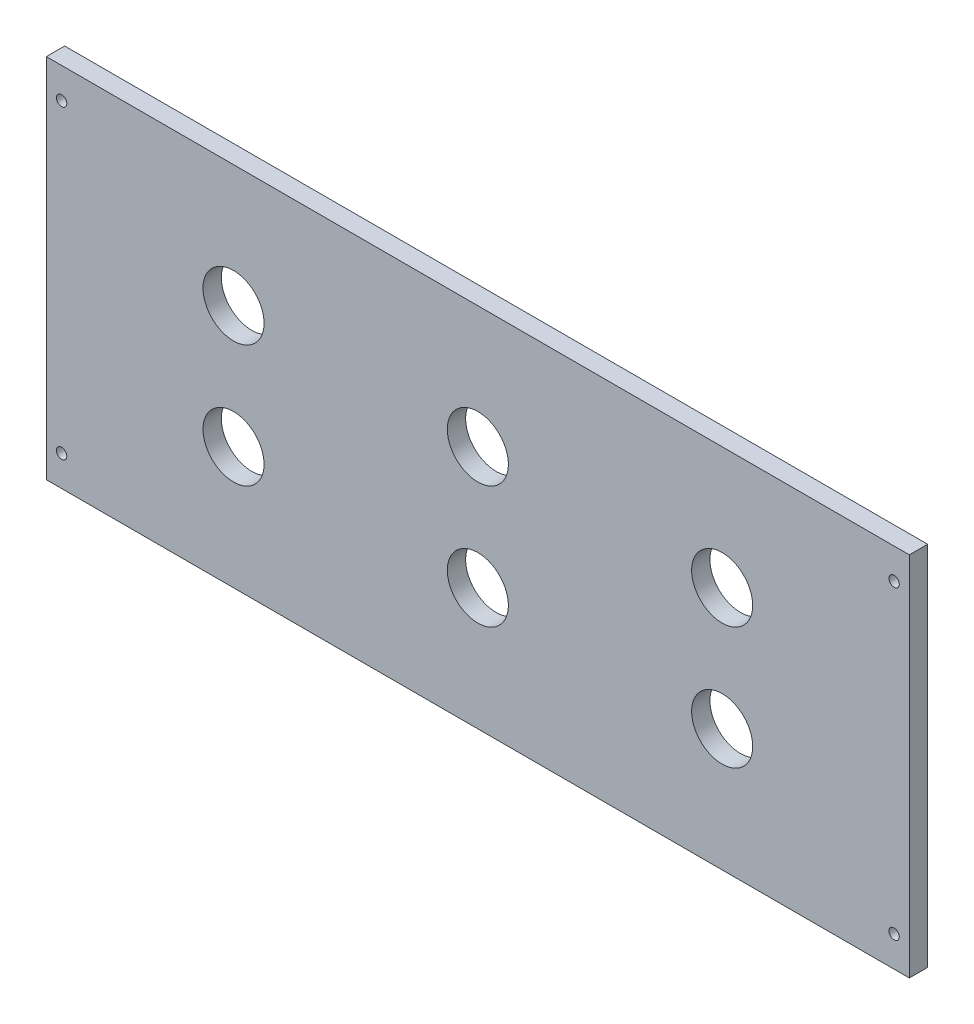
ISO-10303-21;
HEADER;
FILE_DESCRIPTION(('STEP AP214'),'2;1');
FILE_NAME('part.step','',(''),(''),'','','');
FILE_SCHEMA(('AUTOMOTIVE_DESIGN { 1 0 10303 214 1 1 1 1 }'));
ENDSEC;
DATA;
#1=APPLICATION_CONTEXT('core data for automotive mechanical design processes');
#2=APPLICATION_PROTOCOL_DEFINITION('international standard','automotive_design',2000,#1);
#3=PRODUCT_CONTEXT('',#1,'mechanical');
#4=PRODUCT('Part','Part','',(#3));
#5=PRODUCT_RELATED_PRODUCT_CATEGORY('part','',(#4));
#6=PRODUCT_DEFINITION_FORMATION('','',#4);
#7=PRODUCT_DEFINITION_CONTEXT('part definition',#1,'design');
#8=PRODUCT_DEFINITION('design','',#6,#7);
#9=PRODUCT_DEFINITION_SHAPE('','',#8);
#10=(LENGTH_UNIT() NAMED_UNIT(*) SI_UNIT(.MILLI.,.METRE.));
#11=(NAMED_UNIT(*) PLANE_ANGLE_UNIT() SI_UNIT($,.RADIAN.));
#12=(NAMED_UNIT(*) SI_UNIT($,.STERADIAN.) SOLID_ANGLE_UNIT());
#13=UNCERTAINTY_MEASURE_WITH_UNIT(LENGTH_MEASURE(1.E-05),#10,'distance_accuracy_value','');
#14=(GEOMETRIC_REPRESENTATION_CONTEXT(3) GLOBAL_UNCERTAINTY_ASSIGNED_CONTEXT((#13)) GLOBAL_UNIT_ASSIGNED_CONTEXT((#10,
#11,#12)) REPRESENTATION_CONTEXT('',''));
#15=CARTESIAN_POINT('',(0.,0.,0.));
#16=DIRECTION('',(0.,0.,1.));
#17=DIRECTION('',(1.,0.,0.));
#18=AXIS2_PLACEMENT_3D('',#15,#16,#17);
#19=CARTESIAN_POINT('',(0.,0.,3.));
#20=DIRECTION('',(0.,0.,-1.));
#21=DIRECTION('',(-1.,0.,0.));
#22=AXIS2_PLACEMENT_3D('',#19,#20,#21);
#23=PLANE('',#22);
#24=DIRECTION('',(0.,1.,0.));
#25=VECTOR('',#24,1.);
#26=CARTESIAN_POINT('',(70.65,-30.,3.));
#27=LINE('',#26,#25);
#28=CARTESIAN_POINT('',(70.65,-30.,3.));
#29=VERTEX_POINT('',#28);
#30=CARTESIAN_POINT('',(70.65,30.,3.));
#31=VERTEX_POINT('',#30);
#32=EDGE_CURVE('E92',#29,#31,#27,.T.);
#33=ORIENTED_EDGE('',*,*,#32,.T.);
#34=DIRECTION('',(-1.,0.,0.));
#35=VECTOR('',#34,1.);
#36=CARTESIAN_POINT('',(-70.65,30.,3.));
#37=LINE('',#36,#35);
#38=CARTESIAN_POINT('',(-70.65,30.,3.));
#39=VERTEX_POINT('',#38);
#40=EDGE_CURVE('E87',#31,#39,#37,.T.);
#41=ORIENTED_EDGE('',*,*,#40,.T.);
#42=DIRECTION('',(0.,-1.,0.));
#43=VECTOR('',#42,1.);
#44=CARTESIAN_POINT('',(-70.65,-30.,3.));
#45=LINE('',#44,#43);
#46=CARTESIAN_POINT('',(-70.65,-30.,3.));
#47=VERTEX_POINT('',#46);
#48=EDGE_CURVE('E90',#39,#47,#45,.T.);
#49=ORIENTED_EDGE('',*,*,#48,.T.);
#50=DIRECTION('',(1.,0.,0.));
#51=VECTOR('',#50,1.);
#52=CARTESIAN_POINT('',(-70.65,-30.,3.));
#53=LINE('',#52,#51);
#54=EDGE_CURVE('E57',#47,#29,#53,.T.);
#55=ORIENTED_EDGE('',*,*,#54,.T.);
#56=EDGE_LOOP('',(#33,#41,#49,#55));
#57=FACE_BOUND('',#56,.T.);
#58=CARTESIAN_POINT('',(-68.15,25.,3.));
#59=DIRECTION('',(0.,0.,1.));
#60=DIRECTION('',(1.,0.,0.));
#61=AXIS2_PLACEMENT_3D('',#58,#59,#60);
#62=CIRCLE('',#61,0.850000000000006);
#63=CARTESIAN_POINT('',(-67.3,25.,3.));
#64=VERTEX_POINT('',#63);
#65=EDGE_CURVE('E112',#64,#64,#62,.T.);
#66=ORIENTED_EDGE('',*,*,#65,.F.);
#67=EDGE_LOOP('',(#66));
#68=FACE_BOUND('',#67,.T.);
#69=CARTESIAN_POINT('',(-68.15,-25.,3.));
#70=DIRECTION('',(0.,0.,1.));
#71=DIRECTION('',(-1.,0.,0.));
#72=AXIS2_PLACEMENT_3D('',#69,#70,#71);
#73=CIRCLE('',#72,0.850000000000006);
#74=CARTESIAN_POINT('',(-69.,-25.,3.));
#75=VERTEX_POINT('',#74);
#76=EDGE_CURVE('E134',#75,#75,#73,.T.);
#77=ORIENTED_EDGE('',*,*,#76,.F.);
#78=EDGE_LOOP('',(#77));
#79=FACE_BOUND('',#78,.T.);
#80=CARTESIAN_POINT('',(68.15,-25.,3.));
#81=DIRECTION('',(0.,0.,1.));
#82=DIRECTION('',(1.,0.,0.));
#83=AXIS2_PLACEMENT_3D('',#80,#81,#82);
#84=CIRCLE('',#83,0.850000000000006);
#85=CARTESIAN_POINT('',(69.,-25.,3.));
#86=VERTEX_POINT('',#85);
#87=EDGE_CURVE('E142',#86,#86,#84,.T.);
#88=ORIENTED_EDGE('',*,*,#87,.F.);
#89=EDGE_LOOP('',(#88));
#90=FACE_BOUND('',#89,.T.);
#91=CARTESIAN_POINT('',(68.15,25.,3.));
#92=DIRECTION('',(0.,0.,1.));
#93=DIRECTION('',(-1.,0.,0.));
#94=AXIS2_PLACEMENT_3D('',#91,#92,#93);
#95=CIRCLE('',#94,0.850000000000006);
#96=CARTESIAN_POINT('',(67.3,25.,3.));
#97=VERTEX_POINT('',#96);
#98=EDGE_CURVE('E150',#97,#97,#95,.T.);
#99=ORIENTED_EDGE('',*,*,#98,.F.);
#100=EDGE_LOOP('',(#99));
#101=FACE_BOUND('',#100,.T.);
#102=CARTESIAN_POINT('',(0.,-10.,3.));
#103=DIRECTION('',(0.,0.,1.));
#104=DIRECTION('',(1.,0.,0.));
#105=AXIS2_PLACEMENT_3D('',#102,#103,#104);
#106=CIRCLE('',#105,5.);
#107=CARTESIAN_POINT('',(5.00000000000001,-10.,3.));
#108=VERTEX_POINT('',#107);
#109=EDGE_CURVE('E158',#108,#108,#106,.T.);
#110=ORIENTED_EDGE('',*,*,#109,.F.);
#111=EDGE_LOOP('',(#110));
#112=FACE_BOUND('',#111,.T.);
#113=CARTESIAN_POINT('',(-40.,-10.,3.));
#114=DIRECTION('',(0.,0.,1.));
#115=DIRECTION('',(1.,0.,0.));
#116=AXIS2_PLACEMENT_3D('',#113,#114,#115);
#117=CIRCLE('',#116,5.);
#118=CARTESIAN_POINT('',(-35.,-10.,3.));
#119=VERTEX_POINT('',#118);
#120=EDGE_CURVE('E166',#119,#119,#117,.T.);
#121=ORIENTED_EDGE('',*,*,#120,.F.);
#122=EDGE_LOOP('',(#121));
#123=FACE_BOUND('',#122,.T.);
#124=CARTESIAN_POINT('',(40.,-9.99999999999997,3.));
#125=DIRECTION('',(0.,0.,1.));
#126=DIRECTION('',(-1.,0.,0.));
#127=AXIS2_PLACEMENT_3D('',#124,#125,#126);
#128=CIRCLE('',#127,5.);
#129=CARTESIAN_POINT('',(35.,-9.99999999999997,3.));
#130=VERTEX_POINT('',#129);
#131=EDGE_CURVE('E174',#130,#130,#128,.T.);
#132=ORIENTED_EDGE('',*,*,#131,.F.);
#133=EDGE_LOOP('',(#132));
#134=FACE_BOUND('',#133,.T.);
#135=CARTESIAN_POINT('',(40.,9.99999999999996,3.));
#136=DIRECTION('',(0.,0.,1.));
#137=DIRECTION('',(1.,0.,0.));
#138=AXIS2_PLACEMENT_3D('',#135,#136,#137);
#139=CIRCLE('',#138,5.);
#140=CARTESIAN_POINT('',(45.,9.99999999999996,3.));
#141=VERTEX_POINT('',#140);
#142=EDGE_CURVE('E182',#141,#141,#139,.T.);
#143=ORIENTED_EDGE('',*,*,#142,.F.);
#144=EDGE_LOOP('',(#143));
#145=FACE_BOUND('',#144,.T.);
#146=CARTESIAN_POINT('',(0.,9.99999999999998,3.));
#147=DIRECTION('',(0.,0.,1.));
#148=DIRECTION('',(-1.,0.,0.));
#149=AXIS2_PLACEMENT_3D('',#146,#147,#148);
#150=CIRCLE('',#149,5.);
#151=CARTESIAN_POINT('',(-5.,9.99999999999998,3.));
#152=VERTEX_POINT('',#151);
#153=EDGE_CURVE('E190',#152,#152,#150,.T.);
#154=ORIENTED_EDGE('',*,*,#153,.F.);
#155=EDGE_LOOP('',(#154));
#156=FACE_BOUND('',#155,.T.);
#157=CARTESIAN_POINT('',(-40.,9.99999999999998,3.));
#158=DIRECTION('',(0.,0.,1.));
#159=DIRECTION('',(-1.,0.,0.));
#160=AXIS2_PLACEMENT_3D('',#157,#158,#159);
#161=CIRCLE('',#160,5.);
#162=CARTESIAN_POINT('',(-45.,9.99999999999998,3.));
#163=VERTEX_POINT('',#162);
#164=EDGE_CURVE('E198',#163,#163,#161,.T.);
#165=ORIENTED_EDGE('',*,*,#164,.F.);
#166=EDGE_LOOP('',(#165));
#167=FACE_BOUND('',#166,.T.);
#168=ADVANCED_FACE('F39',(#57,#68,#79,#90,#101,#112,#123,#134,#145,#156,#167),#23,.F.);
#169=CARTESIAN_POINT('',(0.,0.,0.));
#170=DIRECTION('',(0.,0.,-1.));
#171=DIRECTION('',(-1.,0.,0.));
#172=AXIS2_PLACEMENT_3D('',#169,#170,#171);
#173=PLANE('',#172);
#174=CARTESIAN_POINT('',(0.,9.99999999999998,0.));
#175=DIRECTION('',(0.,0.,1.));
#176=DIRECTION('',(-1.,0.,0.));
#177=AXIS2_PLACEMENT_3D('',#174,#175,#176);
#178=CIRCLE('',#177,5.);
#179=CARTESIAN_POINT('',(-5.,9.99999999999998,0.));
#180=VERTEX_POINT('',#179);
#181=EDGE_CURVE('E194',#180,#180,#178,.T.);
#182=ORIENTED_EDGE('',*,*,#181,.T.);
#183=EDGE_LOOP('',(#182));
#184=FACE_BOUND('',#183,.T.);
#185=CARTESIAN_POINT('',(40.,-9.99999999999997,0.));
#186=DIRECTION('',(0.,0.,1.));
#187=DIRECTION('',(-1.,0.,0.));
#188=AXIS2_PLACEMENT_3D('',#185,#186,#187);
#189=CIRCLE('',#188,5.);
#190=CARTESIAN_POINT('',(35.,-9.99999999999997,0.));
#191=VERTEX_POINT('',#190);
#192=EDGE_CURVE('E178',#191,#191,#189,.T.);
#193=ORIENTED_EDGE('',*,*,#192,.T.);
#194=EDGE_LOOP('',(#193));
#195=FACE_BOUND('',#194,.T.);
#196=CARTESIAN_POINT('',(0.,-10.,0.));
#197=DIRECTION('',(0.,0.,1.));
#198=DIRECTION('',(1.,0.,0.));
#199=AXIS2_PLACEMENT_3D('',#196,#197,#198);
#200=CIRCLE('',#199,5.);
#201=CARTESIAN_POINT('',(5.00000000000001,-10.,0.));
#202=VERTEX_POINT('',#201);
#203=EDGE_CURVE('E162',#202,#202,#200,.T.);
#204=ORIENTED_EDGE('',*,*,#203,.T.);
#205=EDGE_LOOP('',(#204));
#206=FACE_BOUND('',#205,.T.);
#207=CARTESIAN_POINT('',(68.15,-25.,0.));
#208=DIRECTION('',(0.,0.,1.));
#209=DIRECTION('',(1.,0.,0.));
#210=AXIS2_PLACEMENT_3D('',#207,#208,#209);
#211=CIRCLE('',#210,0.850000000000006);
#212=CARTESIAN_POINT('',(69.,-25.,0.));
#213=VERTEX_POINT('',#212);
#214=EDGE_CURVE('E146',#213,#213,#211,.T.);
#215=ORIENTED_EDGE('',*,*,#214,.T.);
#216=EDGE_LOOP('',(#215));
#217=FACE_BOUND('',#216,.T.);
#218=CARTESIAN_POINT('',(-68.15,25.,0.));
#219=DIRECTION('',(0.,0.,1.));
#220=DIRECTION('',(1.,0.,0.));
#221=AXIS2_PLACEMENT_3D('',#218,#219,#220);
#222=CIRCLE('',#221,0.850000000000006);
#223=CARTESIAN_POINT('',(-67.3,25.,0.));
#224=VERTEX_POINT('',#223);
#225=EDGE_CURVE('E130',#224,#224,#222,.T.);
#226=ORIENTED_EDGE('',*,*,#225,.T.);
#227=EDGE_LOOP('',(#226));
#228=FACE_BOUND('',#227,.T.);
#229=DIRECTION('',(0.,1.,0.));
#230=VECTOR('',#229,1.);
#231=CARTESIAN_POINT('',(70.65,-30.,0.));
#232=LINE('',#231,#230);
#233=CARTESIAN_POINT('',(70.65,-30.,0.));
#234=VERTEX_POINT('',#233);
#235=CARTESIAN_POINT('',(70.65,30.,0.));
#236=VERTEX_POINT('',#235);
#237=EDGE_CURVE('E108',#234,#236,#232,.T.);
#238=ORIENTED_EDGE('',*,*,#237,.F.);
#239=DIRECTION('',(1.,0.,0.));
#240=VECTOR('',#239,1.);
#241=CARTESIAN_POINT('',(-70.65,-30.,0.));
#242=LINE('',#241,#240);
#243=CARTESIAN_POINT('',(-70.65,-30.,0.));
#244=VERTEX_POINT('',#243);
#245=EDGE_CURVE('E80',#244,#234,#242,.T.);
#246=ORIENTED_EDGE('',*,*,#245,.F.);
#247=DIRECTION('',(0.,-1.,0.));
#248=VECTOR('',#247,1.);
#249=CARTESIAN_POINT('',(-70.65,-30.,0.));
#250=LINE('',#249,#248);
#251=CARTESIAN_POINT('',(-70.65,30.,0.));
#252=VERTEX_POINT('',#251);
#253=EDGE_CURVE('E74',#252,#244,#250,.T.);
#254=ORIENTED_EDGE('',*,*,#253,.F.);
#255=DIRECTION('',(-1.,0.,0.));
#256=VECTOR('',#255,1.);
#257=CARTESIAN_POINT('',(-70.65,30.,0.));
#258=LINE('',#257,#256);
#259=EDGE_CURVE('E97',#236,#252,#258,.T.);
#260=ORIENTED_EDGE('',*,*,#259,.F.);
#261=EDGE_LOOP('',(#238,#246,#254,#260));
#262=FACE_BOUND('',#261,.T.);
#263=CARTESIAN_POINT('',(-68.15,-25.,0.));
#264=DIRECTION('',(0.,0.,1.));
#265=DIRECTION('',(-1.,0.,0.));
#266=AXIS2_PLACEMENT_3D('',#263,#264,#265);
#267=CIRCLE('',#266,0.850000000000006);
#268=CARTESIAN_POINT('',(-69.,-25.,0.));
#269=VERTEX_POINT('',#268);
#270=EDGE_CURVE('E138',#269,#269,#267,.T.);
#271=ORIENTED_EDGE('',*,*,#270,.T.);
#272=EDGE_LOOP('',(#271));
#273=FACE_BOUND('',#272,.T.);
#274=CARTESIAN_POINT('',(68.15,25.,0.));
#275=DIRECTION('',(0.,0.,1.));
#276=DIRECTION('',(-1.,0.,0.));
#277=AXIS2_PLACEMENT_3D('',#274,#275,#276);
#278=CIRCLE('',#277,0.850000000000006);
#279=CARTESIAN_POINT('',(67.3,25.,0.));
#280=VERTEX_POINT('',#279);
#281=EDGE_CURVE('E154',#280,#280,#278,.T.);
#282=ORIENTED_EDGE('',*,*,#281,.T.);
#283=EDGE_LOOP('',(#282));
#284=FACE_BOUND('',#283,.T.);
#285=CARTESIAN_POINT('',(-40.,-10.,0.));
#286=DIRECTION('',(0.,0.,1.));
#287=DIRECTION('',(1.,0.,0.));
#288=AXIS2_PLACEMENT_3D('',#285,#286,#287);
#289=CIRCLE('',#288,5.);
#290=CARTESIAN_POINT('',(-35.,-10.,0.));
#291=VERTEX_POINT('',#290);
#292=EDGE_CURVE('E170',#291,#291,#289,.T.);
#293=ORIENTED_EDGE('',*,*,#292,.T.);
#294=EDGE_LOOP('',(#293));
#295=FACE_BOUND('',#294,.T.);
#296=CARTESIAN_POINT('',(40.,9.99999999999996,0.));
#297=DIRECTION('',(0.,0.,1.));
#298=DIRECTION('',(1.,0.,0.));
#299=AXIS2_PLACEMENT_3D('',#296,#297,#298);
#300=CIRCLE('',#299,5.);
#301=CARTESIAN_POINT('',(45.,9.99999999999996,0.));
#302=VERTEX_POINT('',#301);
#303=EDGE_CURVE('E186',#302,#302,#300,.T.);
#304=ORIENTED_EDGE('',*,*,#303,.T.);
#305=EDGE_LOOP('',(#304));
#306=FACE_BOUND('',#305,.T.);
#307=CARTESIAN_POINT('',(-40.,9.99999999999998,0.));
#308=DIRECTION('',(0.,0.,1.));
#309=DIRECTION('',(-1.,0.,0.));
#310=AXIS2_PLACEMENT_3D('',#307,#308,#309);
#311=CIRCLE('',#310,5.);
#312=CARTESIAN_POINT('',(-45.,9.99999999999998,0.));
#313=VERTEX_POINT('',#312);
#314=EDGE_CURVE('E202',#313,#313,#311,.T.);
#315=ORIENTED_EDGE('',*,*,#314,.T.);
#316=EDGE_LOOP('',(#315));
#317=FACE_BOUND('',#316,.T.);
#318=ADVANCED_FACE('F125',(#184,#195,#206,#217,#228,#262,#273,#284,#295,#306,#317),#173,.T.);
#319=CARTESIAN_POINT('',(70.65,-30.,3.));
#320=DIRECTION('',(-1.,0.,0.));
#321=DIRECTION('',(0.,0.,1.));
#322=AXIS2_PLACEMENT_3D('',#319,#320,#321);
#323=PLANE('',#322);
#324=ORIENTED_EDGE('',*,*,#237,.T.);
#325=DIRECTION('',(0.,0.,-1.));
#326=VECTOR('',#325,1.);
#327=CARTESIAN_POINT('',(70.65,30.,3.));
#328=LINE('',#327,#326);
#329=EDGE_CURVE('E11',#31,#236,#328,.T.);
#330=ORIENTED_EDGE('',*,*,#329,.F.);
#331=ORIENTED_EDGE('',*,*,#32,.F.);
#332=DIRECTION('',(0.,0.,-1.));
#333=VECTOR('',#332,1.);
#334=CARTESIAN_POINT('',(70.65,-30.,3.));
#335=LINE('',#334,#333);
#336=EDGE_CURVE('E104',#29,#234,#335,.T.);
#337=ORIENTED_EDGE('',*,*,#336,.T.);
#338=EDGE_LOOP('',(#324,#330,#331,#337));
#339=FACE_BOUND('',#338,.T.);
#340=ADVANCED_FACE('F41',(#339),#323,.F.);
#341=CARTESIAN_POINT('',(-70.65,30.,3.));
#342=DIRECTION('',(0.,-1.,0.));
#343=DIRECTION('',(0.,0.,-1.));
#344=AXIS2_PLACEMENT_3D('',#341,#342,#343);
#345=PLANE('',#344);
#346=ORIENTED_EDGE('',*,*,#259,.T.);
#347=DIRECTION('',(0.,0.,-1.));
#348=VECTOR('',#347,1.);
#349=CARTESIAN_POINT('',(-70.65,30.,3.));
#350=LINE('',#349,#348);
#351=EDGE_CURVE('E49',#39,#252,#350,.T.);
#352=ORIENTED_EDGE('',*,*,#351,.F.);
#353=ORIENTED_EDGE('',*,*,#40,.F.);
#354=ORIENTED_EDGE('',*,*,#329,.T.);
#355=EDGE_LOOP('',(#346,#352,#353,#354));
#356=FACE_BOUND('',#355,.T.);
#357=ADVANCED_FACE('F96',(#356),#345,.F.);
#358=CARTESIAN_POINT('',(-70.65,-30.,3.));
#359=DIRECTION('',(1.,0.,0.));
#360=DIRECTION('',(0.,0.,-1.));
#361=AXIS2_PLACEMENT_3D('',#358,#359,#360);
#362=PLANE('',#361);
#363=ORIENTED_EDGE('',*,*,#253,.T.);
#364=DIRECTION('',(0.,0.,-1.));
#365=VECTOR('',#364,1.);
#366=CARTESIAN_POINT('',(-70.65,-30.,3.));
#367=LINE('',#366,#365);
#368=EDGE_CURVE('E99',#47,#244,#367,.T.);
#369=ORIENTED_EDGE('',*,*,#368,.F.);
#370=ORIENTED_EDGE('',*,*,#48,.F.);
#371=ORIENTED_EDGE('',*,*,#351,.T.);
#372=EDGE_LOOP('',(#363,#369,#370,#371));
#373=FACE_BOUND('',#372,.T.);
#374=ADVANCED_FACE('F100',(#373),#362,.F.);
#375=CARTESIAN_POINT('',(-70.65,-30.,3.));
#376=DIRECTION('',(0.,1.,0.));
#377=DIRECTION('',(0.,0.,1.));
#378=AXIS2_PLACEMENT_3D('',#375,#376,#377);
#379=PLANE('',#378);
#380=ORIENTED_EDGE('',*,*,#245,.T.);
#381=ORIENTED_EDGE('',*,*,#336,.F.);
#382=ORIENTED_EDGE('',*,*,#54,.F.);
#383=ORIENTED_EDGE('',*,*,#368,.T.);
#384=EDGE_LOOP('',(#380,#381,#382,#383));
#385=FACE_BOUND('',#384,.T.);
#386=ADVANCED_FACE('F122',(#385),#379,.F.);
#387=CARTESIAN_POINT('',(-68.15,25.,3.));
#388=DIRECTION('',(0.,0.,-1.));
#389=DIRECTION('',(-1.,0.,0.));
#390=AXIS2_PLACEMENT_3D('',#387,#388,#389);
#391=CYLINDRICAL_SURFACE('',#390,0.850000000000006);
#392=ORIENTED_EDGE('',*,*,#65,.T.);
#393=EDGE_LOOP('',(#392));
#394=FACE_BOUND('',#393,.T.);
#395=ORIENTED_EDGE('',*,*,#225,.F.);
#396=EDGE_LOOP('',(#395));
#397=FACE_BOUND('',#396,.T.);
#398=ADVANCED_FACE('F221',(#394,#397),#391,.F.);
#399=CARTESIAN_POINT('',(-68.15,-25.,3.));
#400=DIRECTION('',(0.,0.,-1.));
#401=DIRECTION('',(-1.,0.,0.));
#402=AXIS2_PLACEMENT_3D('',#399,#400,#401);
#403=CYLINDRICAL_SURFACE('',#402,0.850000000000006);
#404=ORIENTED_EDGE('',*,*,#76,.T.);
#405=EDGE_LOOP('',(#404));
#406=FACE_BOUND('',#405,.T.);
#407=ORIENTED_EDGE('',*,*,#270,.F.);
#408=EDGE_LOOP('',(#407));
#409=FACE_BOUND('',#408,.T.);
#410=ADVANCED_FACE('F267',(#406,#409),#403,.F.);
#411=CARTESIAN_POINT('',(68.15,-25.,3.));
#412=DIRECTION('',(0.,0.,-1.));
#413=DIRECTION('',(-1.,0.,0.));
#414=AXIS2_PLACEMENT_3D('',#411,#412,#413);
#415=CYLINDRICAL_SURFACE('',#414,0.850000000000006);
#416=ORIENTED_EDGE('',*,*,#87,.T.);
#417=EDGE_LOOP('',(#416));
#418=FACE_BOUND('',#417,.T.);
#419=ORIENTED_EDGE('',*,*,#214,.F.);
#420=EDGE_LOOP('',(#419));
#421=FACE_BOUND('',#420,.T.);
#422=ADVANCED_FACE('F275',(#418,#421),#415,.F.);
#423=CARTESIAN_POINT('',(68.15,25.,3.));
#424=DIRECTION('',(0.,0.,-1.));
#425=DIRECTION('',(-1.,0.,0.));
#426=AXIS2_PLACEMENT_3D('',#423,#424,#425);
#427=CYLINDRICAL_SURFACE('',#426,0.850000000000006);
#428=ORIENTED_EDGE('',*,*,#98,.T.);
#429=EDGE_LOOP('',(#428));
#430=FACE_BOUND('',#429,.T.);
#431=ORIENTED_EDGE('',*,*,#281,.F.);
#432=EDGE_LOOP('',(#431));
#433=FACE_BOUND('',#432,.T.);
#434=ADVANCED_FACE('F283',(#430,#433),#427,.F.);
#435=CARTESIAN_POINT('',(0.,-10.,3.));
#436=DIRECTION('',(0.,0.,-1.));
#437=DIRECTION('',(-1.,0.,0.));
#438=AXIS2_PLACEMENT_3D('',#435,#436,#437);
#439=CYLINDRICAL_SURFACE('',#438,5.);
#440=ORIENTED_EDGE('',*,*,#109,.T.);
#441=EDGE_LOOP('',(#440));
#442=FACE_BOUND('',#441,.T.);
#443=ORIENTED_EDGE('',*,*,#203,.F.);
#444=EDGE_LOOP('',(#443));
#445=FACE_BOUND('',#444,.T.);
#446=ADVANCED_FACE('F292',(#442,#445),#439,.F.);
#447=CARTESIAN_POINT('',(-40.,-10.,3.));
#448=DIRECTION('',(0.,0.,-1.));
#449=DIRECTION('',(-1.,0.,0.));
#450=AXIS2_PLACEMENT_3D('',#447,#448,#449);
#451=CYLINDRICAL_SURFACE('',#450,5.);
#452=ORIENTED_EDGE('',*,*,#120,.T.);
#453=EDGE_LOOP('',(#452));
#454=FACE_BOUND('',#453,.T.);
#455=ORIENTED_EDGE('',*,*,#292,.F.);
#456=EDGE_LOOP('',(#455));
#457=FACE_BOUND('',#456,.T.);
#458=ADVANCED_FACE('F301',(#454,#457),#451,.F.);
#459=CARTESIAN_POINT('',(40.,-9.99999999999997,3.));
#460=DIRECTION('',(0.,0.,-1.));
#461=DIRECTION('',(-1.,0.,0.));
#462=AXIS2_PLACEMENT_3D('',#459,#460,#461);
#463=CYLINDRICAL_SURFACE('',#462,5.);
#464=ORIENTED_EDGE('',*,*,#131,.T.);
#465=EDGE_LOOP('',(#464));
#466=FACE_BOUND('',#465,.T.);
#467=ORIENTED_EDGE('',*,*,#192,.F.);
#468=EDGE_LOOP('',(#467));
#469=FACE_BOUND('',#468,.T.);
#470=ADVANCED_FACE('F310',(#466,#469),#463,.F.);
#471=CARTESIAN_POINT('',(40.,9.99999999999996,3.));
#472=DIRECTION('',(0.,0.,-1.));
#473=DIRECTION('',(-1.,0.,0.));
#474=AXIS2_PLACEMENT_3D('',#471,#472,#473);
#475=CYLINDRICAL_SURFACE('',#474,5.);
#476=ORIENTED_EDGE('',*,*,#142,.T.);
#477=EDGE_LOOP('',(#476));
#478=FACE_BOUND('',#477,.T.);
#479=ORIENTED_EDGE('',*,*,#303,.F.);
#480=EDGE_LOOP('',(#479));
#481=FACE_BOUND('',#480,.T.);
#482=ADVANCED_FACE('F319',(#478,#481),#475,.F.);
#483=CARTESIAN_POINT('',(0.,9.99999999999998,3.));
#484=DIRECTION('',(0.,0.,-1.));
#485=DIRECTION('',(-1.,0.,0.));
#486=AXIS2_PLACEMENT_3D('',#483,#484,#485);
#487=CYLINDRICAL_SURFACE('',#486,5.);
#488=ORIENTED_EDGE('',*,*,#153,.T.);
#489=EDGE_LOOP('',(#488));
#490=FACE_BOUND('',#489,.T.);
#491=ORIENTED_EDGE('',*,*,#181,.F.);
#492=EDGE_LOOP('',(#491));
#493=FACE_BOUND('',#492,.T.);
#494=ADVANCED_FACE('F328',(#490,#493),#487,.F.);
#495=CARTESIAN_POINT('',(-40.,9.99999999999998,3.));
#496=DIRECTION('',(0.,0.,-1.));
#497=DIRECTION('',(-1.,0.,0.));
#498=AXIS2_PLACEMENT_3D('',#495,#496,#497);
#499=CYLINDRICAL_SURFACE('',#498,5.);
#500=ORIENTED_EDGE('',*,*,#164,.T.);
#501=EDGE_LOOP('',(#500));
#502=FACE_BOUND('',#501,.T.);
#503=ORIENTED_EDGE('',*,*,#314,.F.);
#504=EDGE_LOOP('',(#503));
#505=FACE_BOUND('',#504,.T.);
#506=ADVANCED_FACE('F210',(#502,#505),#499,.F.);
#507=CLOSED_SHELL('',(#168,#318,#340,#357,#374,#386,#398,#410,#422,#434,#446,#458,#470,#482,
#494,#506));
#508=MANIFOLD_SOLID_BREP('B2',#507);
#509=ADVANCED_BREP_SHAPE_REPRESENTATION('',(#18,#508),#14);
#510=SHAPE_DEFINITION_REPRESENTATION(#9,#509);
ENDSEC;
END-ISO-10303-21;
